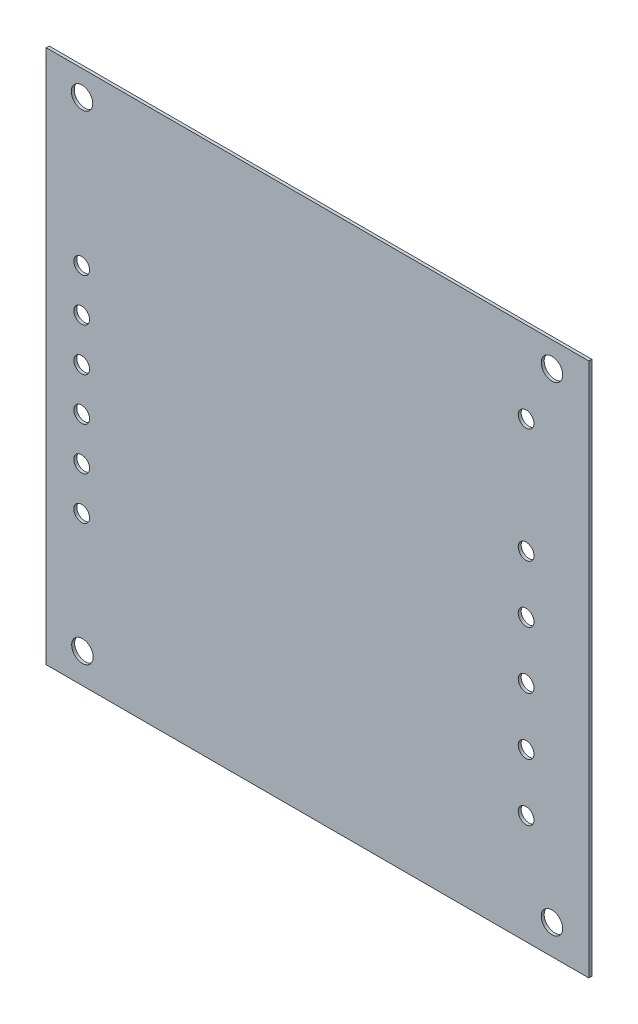
ISO-10303-21;
HEADER;
FILE_DESCRIPTION(('STEP AP214'),'2;1');
FILE_NAME('part.step','',(''),(''),'','','');
FILE_SCHEMA(('AUTOMOTIVE_DESIGN { 1 0 10303 214 1 1 1 1 }'));
ENDSEC;
DATA;
#1=APPLICATION_CONTEXT('core data for automotive mechanical design processes');
#2=APPLICATION_PROTOCOL_DEFINITION('international standard','automotive_design',2000,#1);
#3=PRODUCT_CONTEXT('',#1,'mechanical');
#4=PRODUCT('Part','Part','',(#3));
#5=PRODUCT_RELATED_PRODUCT_CATEGORY('part','',(#4));
#6=PRODUCT_DEFINITION_FORMATION('','',#4);
#7=PRODUCT_DEFINITION_CONTEXT('part definition',#1,'design');
#8=PRODUCT_DEFINITION('design','',#6,#7);
#9=PRODUCT_DEFINITION_SHAPE('','',#8);
#10=(LENGTH_UNIT() NAMED_UNIT(*) SI_UNIT(.MILLI.,.METRE.));
#11=(NAMED_UNIT(*) PLANE_ANGLE_UNIT() SI_UNIT($,.RADIAN.));
#12=(NAMED_UNIT(*) SI_UNIT($,.STERADIAN.) SOLID_ANGLE_UNIT());
#13=UNCERTAINTY_MEASURE_WITH_UNIT(LENGTH_MEASURE(1.E-05),#10,'distance_accuracy_value','');
#14=(GEOMETRIC_REPRESENTATION_CONTEXT(3) GLOBAL_UNCERTAINTY_ASSIGNED_CONTEXT((#13)) GLOBAL_UNIT_ASSIGNED_CONTEXT((#10,
#11,#12)) REPRESENTATION_CONTEXT('',''));
#15=CARTESIAN_POINT('',(0.,0.,0.));
#16=DIRECTION('',(0.,0.,1.));
#17=DIRECTION('',(1.,0.,0.));
#18=AXIS2_PLACEMENT_3D('',#15,#16,#17);
#19=CARTESIAN_POINT('',(37.90950012207,37.338001251221,0.));
#20=DIRECTION('',(0.,0.,-1.));
#21=DIRECTION('',(0.,-1.,0.));
#22=AXIS2_PLACEMENT_3D('',#19,#20,#21);
#23=PLANE('',#22);
#24=CARTESIAN_POINT('',(70.670997619629,71.156997680664,0.));
#25=DIRECTION('',(0.,0.,1.));
#26=DIRECTION('',(1.,0.,0.));
#27=AXIS2_PLACEMENT_3D('',#24,#25,#26);
#28=CIRCLE('',#27,1.5);
#29=CARTESIAN_POINT('',(72.170997619629,71.156997680664,0.));
#30=VERTEX_POINT('',#29);
#31=EDGE_CURVE('E26',#30,#30,#28,.T.);
#32=ORIENTED_EDGE('',*,*,#31,.F.);
#33=EDGE_LOOP('',(#32));
#34=FACE_BOUND('',#33,.T.);
#35=CARTESIAN_POINT('',(67.056,63.267,0.));
#36=DIRECTION('',(0.,0.,1.));
#37=DIRECTION('',(1.,0.,0.));
#38=AXIS2_PLACEMENT_3D('',#35,#36,#37);
#39=CIRCLE('',#38,1.1);
#40=CARTESIAN_POINT('',(68.156,63.267,0.));
#41=VERTEX_POINT('',#40);
#42=EDGE_CURVE('E204',#41,#41,#39,.T.);
#43=ORIENTED_EDGE('',*,*,#42,.F.);
#44=EDGE_LOOP('',(#43));
#45=FACE_BOUND('',#44,.T.);
#46=CARTESIAN_POINT('',(67.056,47.267,0.));
#47=DIRECTION('',(0.,0.,1.));
#48=DIRECTION('',(1.,0.,0.));
#49=AXIS2_PLACEMENT_3D('',#46,#47,#48);
#50=CIRCLE('',#49,1.1);
#51=CARTESIAN_POINT('',(68.156,47.267,0.));
#52=VERTEX_POINT('',#51);
#53=EDGE_CURVE('E195',#52,#52,#50,.T.);
#54=ORIENTED_EDGE('',*,*,#53,.F.);
#55=EDGE_LOOP('',(#54));
#56=FACE_BOUND('',#55,.T.);
#57=CARTESIAN_POINT('',(67.056,39.267,0.));
#58=DIRECTION('',(0.,0.,1.));
#59=DIRECTION('',(1.,0.,0.));
#60=AXIS2_PLACEMENT_3D('',#57,#58,#59);
#61=CIRCLE('',#60,1.1);
#62=CARTESIAN_POINT('',(68.156,39.267,0.));
#63=VERTEX_POINT('',#62);
#64=EDGE_CURVE('E291',#63,#63,#61,.T.);
#65=ORIENTED_EDGE('',*,*,#64,.F.);
#66=EDGE_LOOP('',(#65));
#67=FACE_BOUND('',#66,.T.);
#68=CARTESIAN_POINT('',(67.056,15.267,0.));
#69=DIRECTION('',(0.,0.,1.));
#70=DIRECTION('',(1.,0.,0.));
#71=AXIS2_PLACEMENT_3D('',#68,#69,#70);
#72=CIRCLE('',#71,1.1);
#73=CARTESIAN_POINT('',(68.156,15.267,0.));
#74=VERTEX_POINT('',#73);
#75=EDGE_CURVE('E298',#74,#74,#72,.T.);
#76=ORIENTED_EDGE('',*,*,#75,.F.);
#77=EDGE_LOOP('',(#76));
#78=FACE_BOUND('',#77,.T.);
#79=CARTESIAN_POINT('',(70.670997619629,4.15700006485,0.));
#80=DIRECTION('',(0.,0.,1.));
#81=DIRECTION('',(1.,0.,0.));
#82=AXIS2_PLACEMENT_3D('',#79,#80,#81);
#83=CIRCLE('',#82,1.5);
#84=CARTESIAN_POINT('',(72.170997619629,4.15700006485,0.));
#85=VERTEX_POINT('',#84);
#86=EDGE_CURVE('E323',#85,#85,#83,.T.);
#87=ORIENTED_EDGE('',*,*,#86,.F.);
#88=EDGE_LOOP('',(#87));
#89=FACE_BOUND('',#88,.T.);
#90=CARTESIAN_POINT('',(67.056,31.267,0.));
#91=DIRECTION('',(0.,0.,1.));
#92=DIRECTION('',(1.,0.,0.));
#93=AXIS2_PLACEMENT_3D('',#90,#91,#92);
#94=CIRCLE('',#93,1.1);
#95=CARTESIAN_POINT('',(68.156,31.267,0.));
#96=VERTEX_POINT('',#95);
#97=EDGE_CURVE('E315',#96,#96,#94,.T.);
#98=ORIENTED_EDGE('',*,*,#97,.F.);
#99=EDGE_LOOP('',(#98));
#100=FACE_BOUND('',#99,.T.);
#101=CARTESIAN_POINT('',(67.056,23.267,0.));
#102=DIRECTION('',(0.,0.,1.));
#103=DIRECTION('',(1.,0.,0.));
#104=AXIS2_PLACEMENT_3D('',#101,#102,#103);
#105=CIRCLE('',#104,1.1);
#106=CARTESIAN_POINT('',(68.156,23.267,0.));
#107=VERTEX_POINT('',#106);
#108=EDGE_CURVE('E229',#107,#107,#105,.T.);
#109=ORIENTED_EDGE('',*,*,#108,.F.);
#110=EDGE_LOOP('',(#109));
#111=FACE_BOUND('',#110,.T.);
#112=CARTESIAN_POINT('',(5.,71.156997680664,0.));
#113=DIRECTION('',(0.,0.,1.));
#114=DIRECTION('',(1.,0.,0.));
#115=AXIS2_PLACEMENT_3D('',#112,#113,#114);
#116=CIRCLE('',#115,1.5);
#117=CARTESIAN_POINT('',(6.5,71.156997680664,0.));
#118=VERTEX_POINT('',#117);
#119=EDGE_CURVE('E270',#118,#118,#116,.T.);
#120=ORIENTED_EDGE('',*,*,#119,.F.);
#121=EDGE_LOOP('',(#120));
#122=FACE_BOUND('',#121,.T.);
#123=CARTESIAN_POINT('',(4.953,50.791,0.));
#124=DIRECTION('',(0.,0.,1.));
#125=DIRECTION('',(1.,0.,0.));
#126=AXIS2_PLACEMENT_3D('',#123,#124,#125);
#127=CIRCLE('',#126,1.1);
#128=CARTESIAN_POINT('',(6.053,50.791,0.));
#129=VERTEX_POINT('',#128);
#130=EDGE_CURVE('E251',#129,#129,#127,.T.);
#131=ORIENTED_EDGE('',*,*,#130,.F.);
#132=EDGE_LOOP('',(#131));
#133=FACE_BOUND('',#132,.T.);
#134=CARTESIAN_POINT('',(4.953,44.791,0.));
#135=DIRECTION('',(0.,0.,1.));
#136=DIRECTION('',(1.,0.,0.));
#137=AXIS2_PLACEMENT_3D('',#134,#135,#136);
#138=CIRCLE('',#137,1.1);
#139=CARTESIAN_POINT('',(6.053,44.791,0.));
#140=VERTEX_POINT('',#139);
#141=EDGE_CURVE('E242',#140,#140,#138,.T.);
#142=ORIENTED_EDGE('',*,*,#141,.F.);
#143=EDGE_LOOP('',(#142));
#144=FACE_BOUND('',#143,.T.);
#145=CARTESIAN_POINT('',(4.953,38.791,0.));
#146=DIRECTION('',(0.,0.,1.));
#147=DIRECTION('',(1.,0.,0.));
#148=AXIS2_PLACEMENT_3D('',#145,#146,#147);
#149=CIRCLE('',#148,1.1);
#150=CARTESIAN_POINT('',(6.053,38.791,0.));
#151=VERTEX_POINT('',#150);
#152=EDGE_CURVE('E264',#151,#151,#149,.T.);
#153=ORIENTED_EDGE('',*,*,#152,.F.);
#154=EDGE_LOOP('',(#153));
#155=FACE_BOUND('',#154,.T.);
#156=CARTESIAN_POINT('',(4.953,20.791,0.));
#157=DIRECTION('',(0.,0.,1.));
#158=DIRECTION('',(1.,0.,0.));
#159=AXIS2_PLACEMENT_3D('',#156,#157,#158);
#160=CIRCLE('',#159,1.1);
#161=CARTESIAN_POINT('',(6.053,20.791,0.));
#162=VERTEX_POINT('',#161);
#163=EDGE_CURVE('E165',#162,#162,#160,.T.);
#164=ORIENTED_EDGE('',*,*,#163,.F.);
#165=EDGE_LOOP('',(#164));
#166=FACE_BOUND('',#165,.T.);
#167=CARTESIAN_POINT('',(5.056000232697,4.190999984741,0.));
#168=DIRECTION('',(0.,0.,1.));
#169=DIRECTION('',(1.,0.,0.));
#170=AXIS2_PLACEMENT_3D('',#167,#168,#169);
#171=CIRCLE('',#170,1.5);
#172=CARTESIAN_POINT('',(6.556000232697,4.190999984741,0.));
#173=VERTEX_POINT('',#172);
#174=EDGE_CURVE('E157',#173,#173,#171,.T.);
#175=ORIENTED_EDGE('',*,*,#174,.F.);
#176=EDGE_LOOP('',(#175));
#177=FACE_BOUND('',#176,.T.);
#178=CARTESIAN_POINT('',(4.953,32.791,0.));
#179=DIRECTION('',(0.,0.,1.));
#180=DIRECTION('',(1.,0.,0.));
#181=AXIS2_PLACEMENT_3D('',#178,#179,#180);
#182=CIRCLE('',#181,1.1);
#183=CARTESIAN_POINT('',(6.053,32.791,0.));
#184=VERTEX_POINT('',#183);
#185=EDGE_CURVE('E182',#184,#184,#182,.T.);
#186=ORIENTED_EDGE('',*,*,#185,.F.);
#187=EDGE_LOOP('',(#186));
#188=FACE_BOUND('',#187,.T.);
#189=CARTESIAN_POINT('',(4.953,26.791,0.));
#190=DIRECTION('',(0.,0.,1.));
#191=DIRECTION('',(1.,0.,0.));
#192=AXIS2_PLACEMENT_3D('',#189,#190,#191);
#193=CIRCLE('',#192,1.1);
#194=CARTESIAN_POINT('',(6.053,26.791,0.));
#195=VERTEX_POINT('',#194);
#196=EDGE_CURVE('E255',#195,#195,#193,.T.);
#197=ORIENTED_EDGE('',*,*,#196,.F.);
#198=EDGE_LOOP('',(#197));
#199=FACE_BOUND('',#198,.T.);
#200=DIRECTION('',(-1.,0.,0.));
#201=VECTOR('',#200,1.);
#202=CARTESIAN_POINT('',(75.819000244141,0.,0.));
#203=LINE('',#202,#201);
#204=CARTESIAN_POINT('',(75.819000244141,0.,0.));
#205=VERTEX_POINT('',#204);
#206=CARTESIAN_POINT('',(0.,0.,0.));
#207=VERTEX_POINT('',#206);
#208=EDGE_CURVE('E173',#205,#207,#203,.T.);
#209=ORIENTED_EDGE('',*,*,#208,.F.);
#210=DIRECTION('',(0.,-1.,0.));
#211=VECTOR('',#210,1.);
#212=CARTESIAN_POINT('',(75.819000244141,74.676002502441,0.));
#213=LINE('',#212,#211);
#214=CARTESIAN_POINT('',(75.819000244141,74.676002502441,0.));
#215=VERTEX_POINT('',#214);
#216=EDGE_CURVE('E280',#215,#205,#213,.T.);
#217=ORIENTED_EDGE('',*,*,#216,.F.);
#218=DIRECTION('',(1.,0.,0.));
#219=VECTOR('',#218,1.);
#220=CARTESIAN_POINT('',(0.,74.676002502441,0.));
#221=LINE('',#220,#219);
#222=CARTESIAN_POINT('',(0.,74.676002502441,0.));
#223=VERTEX_POINT('',#222);
#224=EDGE_CURVE('E221',#223,#215,#221,.T.);
#225=ORIENTED_EDGE('',*,*,#224,.F.);
#226=DIRECTION('',(0.,1.,0.));
#227=VECTOR('',#226,1.);
#228=CARTESIAN_POINT('',(0.,0.,0.));
#229=LINE('',#228,#227);
#230=EDGE_CURVE('E210',#207,#223,#229,.T.);
#231=ORIENTED_EDGE('',*,*,#230,.F.);
#232=EDGE_LOOP('',(#209,#217,#225,#231));
#233=FACE_BOUND('',#232,.T.);
#234=ADVANCED_FACE('F15',(#34,#45,#56,#67,#78,#89,#100,#111,#122,#133,#144,#155,#166,#177,#188,
#199,#233),#23,.F.);
#235=CARTESIAN_POINT('',(37.90950012207,37.338001251221,-0.41148));
#236=DIRECTION('',(0.,0.,-1.));
#237=DIRECTION('',(0.,-1.,0.));
#238=AXIS2_PLACEMENT_3D('',#235,#236,#237);
#239=PLANE('',#238);
#240=CARTESIAN_POINT('',(70.670997619629,71.156997680664,-0.41148));
#241=DIRECTION('',(0.,0.,1.));
#242=DIRECTION('',(1.,0.,0.));
#243=AXIS2_PLACEMENT_3D('',#240,#241,#242);
#244=CIRCLE('',#243,1.5);
#245=CARTESIAN_POINT('',(72.170997619629,71.156997680664,-0.41148));
#246=VERTEX_POINT('',#245);
#247=EDGE_CURVE('E10',#246,#246,#244,.T.);
#248=ORIENTED_EDGE('',*,*,#247,.T.);
#249=EDGE_LOOP('',(#248));
#250=FACE_BOUND('',#249,.T.);
#251=CARTESIAN_POINT('',(67.056,63.267,-0.41148));
#252=DIRECTION('',(0.,0.,1.));
#253=DIRECTION('',(1.,0.,0.));
#254=AXIS2_PLACEMENT_3D('',#251,#252,#253);
#255=CIRCLE('',#254,1.1);
#256=CARTESIAN_POINT('',(68.156,63.267,-0.41148));
#257=VERTEX_POINT('',#256);
#258=EDGE_CURVE('E200',#257,#257,#255,.T.);
#259=ORIENTED_EDGE('',*,*,#258,.T.);
#260=EDGE_LOOP('',(#259));
#261=FACE_BOUND('',#260,.T.);
#262=CARTESIAN_POINT('',(67.056,47.267,-0.41148));
#263=DIRECTION('',(0.,0.,1.));
#264=DIRECTION('',(1.,0.,0.));
#265=AXIS2_PLACEMENT_3D('',#262,#263,#264);
#266=CIRCLE('',#265,1.1);
#267=CARTESIAN_POINT('',(68.156,47.267,-0.41148));
#268=VERTEX_POINT('',#267);
#269=EDGE_CURVE('E199',#268,#268,#266,.T.);
#270=ORIENTED_EDGE('',*,*,#269,.T.);
#271=EDGE_LOOP('',(#270));
#272=FACE_BOUND('',#271,.T.);
#273=CARTESIAN_POINT('',(67.056,39.267,-0.41148));
#274=DIRECTION('',(0.,0.,1.));
#275=DIRECTION('',(1.,0.,0.));
#276=AXIS2_PLACEMENT_3D('',#273,#274,#275);
#277=CIRCLE('',#276,1.1);
#278=CARTESIAN_POINT('',(68.156,39.267,-0.41148));
#279=VERTEX_POINT('',#278);
#280=EDGE_CURVE('E196',#279,#279,#277,.T.);
#281=ORIENTED_EDGE('',*,*,#280,.T.);
#282=EDGE_LOOP('',(#281));
#283=FACE_BOUND('',#282,.T.);
#284=CARTESIAN_POINT('',(67.056,15.267,-0.41148));
#285=DIRECTION('',(0.,0.,1.));
#286=DIRECTION('',(1.,0.,0.));
#287=AXIS2_PLACEMENT_3D('',#284,#285,#286);
#288=CIRCLE('',#287,1.1);
#289=CARTESIAN_POINT('',(68.156,15.267,-0.41148));
#290=VERTEX_POINT('',#289);
#291=EDGE_CURVE('E171',#290,#290,#288,.T.);
#292=ORIENTED_EDGE('',*,*,#291,.T.);
#293=EDGE_LOOP('',(#292));
#294=FACE_BOUND('',#293,.T.);
#295=CARTESIAN_POINT('',(70.670997619629,4.15700006485,-0.41148));
#296=DIRECTION('',(0.,0.,1.));
#297=DIRECTION('',(1.,0.,0.));
#298=AXIS2_PLACEMENT_3D('',#295,#296,#297);
#299=CIRCLE('',#298,1.5);
#300=CARTESIAN_POINT('',(72.170997619629,4.15700006485,-0.41148));
#301=VERTEX_POINT('',#300);
#302=EDGE_CURVE('E305',#301,#301,#299,.T.);
#303=ORIENTED_EDGE('',*,*,#302,.T.);
#304=EDGE_LOOP('',(#303));
#305=FACE_BOUND('',#304,.T.);
#306=CARTESIAN_POINT('',(67.056,31.267,-0.41148));
#307=DIRECTION('',(0.,0.,1.));
#308=DIRECTION('',(1.,0.,0.));
#309=AXIS2_PLACEMENT_3D('',#306,#307,#308);
#310=CIRCLE('',#309,1.1);
#311=CARTESIAN_POINT('',(68.156,31.267,-0.41148));
#312=VERTEX_POINT('',#311);
#313=EDGE_CURVE('E319',#312,#312,#310,.T.);
#314=ORIENTED_EDGE('',*,*,#313,.T.);
#315=EDGE_LOOP('',(#314));
#316=FACE_BOUND('',#315,.T.);
#317=CARTESIAN_POINT('',(67.056,23.267,-0.41148));
#318=DIRECTION('',(0.,0.,1.));
#319=DIRECTION('',(1.,0.,0.));
#320=AXIS2_PLACEMENT_3D('',#317,#318,#319);
#321=CIRCLE('',#320,1.1);
#322=CARTESIAN_POINT('',(68.156,23.267,-0.41148));
#323=VERTEX_POINT('',#322);
#324=EDGE_CURVE('E696',#323,#323,#321,.T.);
#325=ORIENTED_EDGE('',*,*,#324,.T.);
#326=EDGE_LOOP('',(#325));
#327=FACE_BOUND('',#326,.T.);
#328=CARTESIAN_POINT('',(5.,71.156997680664,-0.41148));
#329=DIRECTION('',(0.,0.,1.));
#330=DIRECTION('',(1.,0.,0.));
#331=AXIS2_PLACEMENT_3D('',#328,#329,#330);
#332=CIRCLE('',#331,1.5);
#333=CARTESIAN_POINT('',(6.5,71.156997680664,-0.41148));
#334=VERTEX_POINT('',#333);
#335=EDGE_CURVE('E230',#334,#334,#332,.T.);
#336=ORIENTED_EDGE('',*,*,#335,.T.);
#337=EDGE_LOOP('',(#336));
#338=FACE_BOUND('',#337,.T.);
#339=CARTESIAN_POINT('',(4.953,50.791,-0.41148));
#340=DIRECTION('',(0.,0.,1.));
#341=DIRECTION('',(1.,0.,0.));
#342=AXIS2_PLACEMENT_3D('',#339,#340,#341);
#343=CIRCLE('',#342,1.1);
#344=CARTESIAN_POINT('',(6.053,50.791,-0.41148));
#345=VERTEX_POINT('',#344);
#346=EDGE_CURVE('E247',#345,#345,#343,.T.);
#347=ORIENTED_EDGE('',*,*,#346,.T.);
#348=EDGE_LOOP('',(#347));
#349=FACE_BOUND('',#348,.T.);
#350=CARTESIAN_POINT('',(4.953,44.791,-0.41148));
#351=DIRECTION('',(0.,0.,1.));
#352=DIRECTION('',(1.,0.,0.));
#353=AXIS2_PLACEMENT_3D('',#350,#351,#352);
#354=CIRCLE('',#353,1.1);
#355=CARTESIAN_POINT('',(6.053,44.791,-0.41148));
#356=VERTEX_POINT('',#355);
#357=EDGE_CURVE('E237',#356,#356,#354,.T.);
#358=ORIENTED_EDGE('',*,*,#357,.T.);
#359=EDGE_LOOP('',(#358));
#360=FACE_BOUND('',#359,.T.);
#361=CARTESIAN_POINT('',(4.953,38.791,-0.41148));
#362=DIRECTION('',(0.,0.,1.));
#363=DIRECTION('',(1.,0.,0.));
#364=AXIS2_PLACEMENT_3D('',#361,#362,#363);
#365=CIRCLE('',#364,1.1);
#366=CARTESIAN_POINT('',(6.053,38.791,-0.41148));
#367=VERTEX_POINT('',#366);
#368=EDGE_CURVE('E279',#367,#367,#365,.T.);
#369=ORIENTED_EDGE('',*,*,#368,.T.);
#370=EDGE_LOOP('',(#369));
#371=FACE_BOUND('',#370,.T.);
#372=CARTESIAN_POINT('',(4.953,20.791,-0.41148));
#373=DIRECTION('',(0.,0.,1.));
#374=DIRECTION('',(1.,0.,0.));
#375=AXIS2_PLACEMENT_3D('',#372,#373,#374);
#376=CIRCLE('',#375,1.1);
#377=CARTESIAN_POINT('',(6.053,20.791,-0.41148));
#378=VERTEX_POINT('',#377);
#379=EDGE_CURVE('E187',#378,#378,#376,.T.);
#380=ORIENTED_EDGE('',*,*,#379,.T.);
#381=EDGE_LOOP('',(#380));
#382=FACE_BOUND('',#381,.T.);
#383=CARTESIAN_POINT('',(5.056000232697,4.190999984741,-0.41148));
#384=DIRECTION('',(0.,0.,1.));
#385=DIRECTION('',(1.,0.,0.));
#386=AXIS2_PLACEMENT_3D('',#383,#384,#385);
#387=CIRCLE('',#386,1.5);
#388=CARTESIAN_POINT('',(6.556000232697,4.190999984741,-0.41148));
#389=VERTEX_POINT('',#388);
#390=EDGE_CURVE('E149',#389,#389,#387,.T.);
#391=ORIENTED_EDGE('',*,*,#390,.T.);
#392=EDGE_LOOP('',(#391));
#393=FACE_BOUND('',#392,.T.);
#394=CARTESIAN_POINT('',(4.953,32.791,-0.41148));
#395=DIRECTION('',(0.,0.,1.));
#396=DIRECTION('',(1.,0.,0.));
#397=AXIS2_PLACEMENT_3D('',#394,#395,#396);
#398=CIRCLE('',#397,1.1);
#399=CARTESIAN_POINT('',(6.053,32.791,-0.41148));
#400=VERTEX_POINT('',#399);
#401=EDGE_CURVE('E184',#400,#400,#398,.T.);
#402=ORIENTED_EDGE('',*,*,#401,.T.);
#403=EDGE_LOOP('',(#402));
#404=FACE_BOUND('',#403,.T.);
#405=CARTESIAN_POINT('',(4.953,26.791,-0.41148));
#406=DIRECTION('',(0.,0.,1.));
#407=DIRECTION('',(1.,0.,0.));
#408=AXIS2_PLACEMENT_3D('',#405,#406,#407);
#409=CIRCLE('',#408,1.1);
#410=CARTESIAN_POINT('',(6.053,26.791,-0.41148));
#411=VERTEX_POINT('',#410);
#412=EDGE_CURVE('E297',#411,#411,#409,.T.);
#413=ORIENTED_EDGE('',*,*,#412,.T.);
#414=EDGE_LOOP('',(#413));
#415=FACE_BOUND('',#414,.T.);
#416=DIRECTION('',(0.,1.,0.));
#417=VECTOR('',#416,1.);
#418=CARTESIAN_POINT('',(0.,0.,-0.41148));
#419=LINE('',#418,#417);
#420=CARTESIAN_POINT('',(0.,0.,-0.41148));
#421=VERTEX_POINT('',#420);
#422=CARTESIAN_POINT('',(0.,74.676002502441,-0.41148));
#423=VERTEX_POINT('',#422);
#424=EDGE_CURVE('E209',#421,#423,#419,.T.);
#425=ORIENTED_EDGE('',*,*,#424,.T.);
#426=DIRECTION('',(1.,0.,0.));
#427=VECTOR('',#426,1.);
#428=CARTESIAN_POINT('',(0.,74.676002502441,-0.41148));
#429=LINE('',#428,#427);
#430=CARTESIAN_POINT('',(75.819000244141,74.676002502441,-0.41148));
#431=VERTEX_POINT('',#430);
#432=EDGE_CURVE('E220',#423,#431,#429,.T.);
#433=ORIENTED_EDGE('',*,*,#432,.T.);
#434=DIRECTION('',(0.,-1.,0.));
#435=VECTOR('',#434,1.);
#436=CARTESIAN_POINT('',(75.819000244141,74.676002502441,-0.41148));
#437=LINE('',#436,#435);
#438=CARTESIAN_POINT('',(75.819000244141,0.,-0.41148));
#439=VERTEX_POINT('',#438);
#440=EDGE_CURVE('E177',#431,#439,#437,.T.);
#441=ORIENTED_EDGE('',*,*,#440,.T.);
#442=DIRECTION('',(-1.,0.,0.));
#443=VECTOR('',#442,1.);
#444=CARTESIAN_POINT('',(75.819000244141,0.,-0.41148));
#445=LINE('',#444,#443);
#446=EDGE_CURVE('E176',#439,#421,#445,.T.);
#447=ORIENTED_EDGE('',*,*,#446,.T.);
#448=EDGE_LOOP('',(#425,#433,#441,#447));
#449=FACE_BOUND('',#448,.T.);
#450=ADVANCED_FACE('F150',(#250,#261,#272,#283,#294,#305,#316,#327,#338,#349,#360,#371,#382,
#393,#404,#415,#449),#239,.T.);
#451=CARTESIAN_POINT('',(70.670997619629,71.156997680664,-0.41148));
#452=DIRECTION('',(0.,0.,-1.));
#453=DIRECTION('',(1.,0.,0.));
#454=AXIS2_PLACEMENT_3D('',#451,#452,#453);
#455=CYLINDRICAL_SURFACE('',#454,1.5);
#456=DIRECTION('',(0.,0.,1.));
#457=VECTOR('',#456,1.);
#458=CARTESIAN_POINT('',(72.170997619629,71.156997680664,-0.41148));
#459=LINE('',#458,#457);
#460=EDGE_CURVE('E203',#246,#30,#459,.T.);
#461=ORIENTED_EDGE('',*,*,#460,.T.);
#462=ORIENTED_EDGE('',*,*,#31,.T.);
#463=ORIENTED_EDGE('',*,*,#460,.F.);
#464=ORIENTED_EDGE('',*,*,#247,.F.);
#465=EDGE_LOOP('',(#461,#462,#463,#464));
#466=FACE_BOUND('',#465,.T.);
#467=ADVANCED_FACE('F427',(#466),#455,.F.);
#468=CARTESIAN_POINT('',(67.056,63.267,-0.41148));
#469=DIRECTION('',(0.,0.,-1.));
#470=DIRECTION('',(1.,0.,0.));
#471=AXIS2_PLACEMENT_3D('',#468,#469,#470);
#472=CYLINDRICAL_SURFACE('',#471,1.1);
#473=DIRECTION('',(0.,0.,1.));
#474=VECTOR('',#473,1.);
#475=CARTESIAN_POINT('',(68.156,63.267,-0.41148));
#476=LINE('',#475,#474);
#477=EDGE_CURVE('E233',#257,#41,#476,.T.);
#478=ORIENTED_EDGE('',*,*,#477,.T.);
#479=ORIENTED_EDGE('',*,*,#42,.T.);
#480=ORIENTED_EDGE('',*,*,#477,.F.);
#481=ORIENTED_EDGE('',*,*,#258,.F.);
#482=EDGE_LOOP('',(#478,#479,#480,#481));
#483=FACE_BOUND('',#482,.T.);
#484=ADVANCED_FACE('F416',(#483),#472,.F.);
#485=CARTESIAN_POINT('',(67.056,47.267,-0.41148));
#486=DIRECTION('',(0.,0.,-1.));
#487=DIRECTION('',(1.,0.,0.));
#488=AXIS2_PLACEMENT_3D('',#485,#486,#487);
#489=CYLINDRICAL_SURFACE('',#488,1.1);
#490=DIRECTION('',(0.,0.,1.));
#491=VECTOR('',#490,1.);
#492=CARTESIAN_POINT('',(68.156,47.267,-0.41148));
#493=LINE('',#492,#491);
#494=EDGE_CURVE('E191',#268,#52,#493,.T.);
#495=ORIENTED_EDGE('',*,*,#494,.T.);
#496=ORIENTED_EDGE('',*,*,#53,.T.);
#497=ORIENTED_EDGE('',*,*,#494,.F.);
#498=ORIENTED_EDGE('',*,*,#269,.F.);
#499=EDGE_LOOP('',(#495,#496,#497,#498));
#500=FACE_BOUND('',#499,.T.);
#501=ADVANCED_FACE('F424',(#500),#489,.F.);
#502=CARTESIAN_POINT('',(67.056,39.267,-0.41148));
#503=DIRECTION('',(0.,0.,-1.));
#504=DIRECTION('',(1.,0.,0.));
#505=AXIS2_PLACEMENT_3D('',#502,#503,#504);
#506=CYLINDRICAL_SURFACE('',#505,1.1);
#507=DIRECTION('',(0.,0.,1.));
#508=VECTOR('',#507,1.);
#509=CARTESIAN_POINT('',(68.156,39.267,-0.41148));
#510=LINE('',#509,#508);
#511=EDGE_CURVE('E287',#279,#63,#510,.T.);
#512=ORIENTED_EDGE('',*,*,#511,.T.);
#513=ORIENTED_EDGE('',*,*,#64,.T.);
#514=ORIENTED_EDGE('',*,*,#511,.F.);
#515=ORIENTED_EDGE('',*,*,#280,.F.);
#516=EDGE_LOOP('',(#512,#513,#514,#515));
#517=FACE_BOUND('',#516,.T.);
#518=ADVANCED_FACE('F340',(#517),#506,.F.);
#519=CARTESIAN_POINT('',(67.056,15.267,-0.41148));
#520=DIRECTION('',(0.,0.,-1.));
#521=DIRECTION('',(1.,0.,0.));
#522=AXIS2_PLACEMENT_3D('',#519,#520,#521);
#523=CYLINDRICAL_SURFACE('',#522,1.1);
#524=DIRECTION('',(0.,0.,1.));
#525=VECTOR('',#524,1.);
#526=CARTESIAN_POINT('',(68.156,15.267,-0.41148));
#527=LINE('',#526,#525);
#528=EDGE_CURVE('E301',#290,#74,#527,.T.);
#529=ORIENTED_EDGE('',*,*,#528,.T.);
#530=ORIENTED_EDGE('',*,*,#75,.T.);
#531=ORIENTED_EDGE('',*,*,#528,.F.);
#532=ORIENTED_EDGE('',*,*,#291,.F.);
#533=EDGE_LOOP('',(#529,#530,#531,#532));
#534=FACE_BOUND('',#533,.T.);
#535=ADVANCED_FACE('F475',(#534),#523,.F.);
#536=CARTESIAN_POINT('',(70.670997619629,4.15700006485,-0.41148));
#537=DIRECTION('',(0.,0.,-1.));
#538=DIRECTION('',(1.,0.,0.));
#539=AXIS2_PLACEMENT_3D('',#536,#537,#538);
#540=CYLINDRICAL_SURFACE('',#539,1.5);
#541=DIRECTION('',(0.,0.,1.));
#542=VECTOR('',#541,1.);
#543=CARTESIAN_POINT('',(72.170997619629,4.15700006485,-0.41148));
#544=LINE('',#543,#542);
#545=EDGE_CURVE('E708',#301,#85,#544,.T.);
#546=ORIENTED_EDGE('',*,*,#545,.T.);
#547=ORIENTED_EDGE('',*,*,#86,.T.);
#548=ORIENTED_EDGE('',*,*,#545,.F.);
#549=ORIENTED_EDGE('',*,*,#302,.F.);
#550=EDGE_LOOP('',(#546,#547,#548,#549));
#551=FACE_BOUND('',#550,.T.);
#552=ADVANCED_FACE('F471',(#551),#540,.F.);
#553=CARTESIAN_POINT('',(67.056,31.267,-0.41148));
#554=DIRECTION('',(0.,0.,-1.));
#555=DIRECTION('',(1.,0.,0.));
#556=AXIS2_PLACEMENT_3D('',#553,#554,#555);
#557=CYLINDRICAL_SURFACE('',#556,1.1);
#558=DIRECTION('',(0.,0.,1.));
#559=VECTOR('',#558,1.);
#560=CARTESIAN_POINT('',(68.156,31.267,-0.41148));
#561=LINE('',#560,#559);
#562=EDGE_CURVE('E320',#312,#96,#561,.T.);
#563=ORIENTED_EDGE('',*,*,#562,.T.);
#564=ORIENTED_EDGE('',*,*,#97,.T.);
#565=ORIENTED_EDGE('',*,*,#562,.F.);
#566=ORIENTED_EDGE('',*,*,#313,.F.);
#567=EDGE_LOOP('',(#563,#564,#565,#566));
#568=FACE_BOUND('',#567,.T.);
#569=ADVANCED_FACE('F474',(#568),#557,.F.);
#570=CARTESIAN_POINT('',(67.056,23.267,-0.41148));
#571=DIRECTION('',(0.,0.,-1.));
#572=DIRECTION('',(1.,0.,0.));
#573=AXIS2_PLACEMENT_3D('',#570,#571,#572);
#574=CYLINDRICAL_SURFACE('',#573,1.1);
#575=DIRECTION('',(0.,0.,1.));
#576=VECTOR('',#575,1.);
#577=CARTESIAN_POINT('',(68.156,23.267,-0.41148));
#578=LINE('',#577,#576);
#579=EDGE_CURVE('E225',#323,#107,#578,.T.);
#580=ORIENTED_EDGE('',*,*,#579,.T.);
#581=ORIENTED_EDGE('',*,*,#108,.T.);
#582=ORIENTED_EDGE('',*,*,#579,.F.);
#583=ORIENTED_EDGE('',*,*,#324,.F.);
#584=EDGE_LOOP('',(#580,#581,#582,#583));
#585=FACE_BOUND('',#584,.T.);
#586=ADVANCED_FACE('F441',(#585),#574,.F.);
#587=CARTESIAN_POINT('',(5.,71.156997680664,-0.41148));
#588=DIRECTION('',(0.,0.,-1.));
#589=DIRECTION('',(1.,0.,0.));
#590=AXIS2_PLACEMENT_3D('',#587,#588,#589);
#591=CYLINDRICAL_SURFACE('',#590,1.5);
#592=DIRECTION('',(0.,0.,1.));
#593=VECTOR('',#592,1.);
#594=CARTESIAN_POINT('',(6.5,71.156997680664,-0.41148));
#595=LINE('',#594,#593);
#596=EDGE_CURVE('E250',#334,#118,#595,.T.);
#597=ORIENTED_EDGE('',*,*,#596,.T.);
#598=ORIENTED_EDGE('',*,*,#119,.T.);
#599=ORIENTED_EDGE('',*,*,#596,.F.);
#600=ORIENTED_EDGE('',*,*,#335,.F.);
#601=EDGE_LOOP('',(#597,#598,#599,#600));
#602=FACE_BOUND('',#601,.T.);
#603=ADVANCED_FACE('F437',(#602),#591,.F.);
#604=CARTESIAN_POINT('',(4.953,50.791,-0.41148));
#605=DIRECTION('',(0.,0.,-1.));
#606=DIRECTION('',(1.,0.,0.));
#607=AXIS2_PLACEMENT_3D('',#604,#605,#606);
#608=CYLINDRICAL_SURFACE('',#607,1.1);
#609=DIRECTION('',(0.,0.,1.));
#610=VECTOR('',#609,1.);
#611=CARTESIAN_POINT('',(6.053,50.791,-0.41148));
#612=LINE('',#611,#610);
#613=EDGE_CURVE('E241',#345,#129,#612,.T.);
#614=ORIENTED_EDGE('',*,*,#613,.T.);
#615=ORIENTED_EDGE('',*,*,#130,.T.);
#616=ORIENTED_EDGE('',*,*,#613,.F.);
#617=ORIENTED_EDGE('',*,*,#346,.F.);
#618=EDGE_LOOP('',(#614,#615,#616,#617));
#619=FACE_BOUND('',#618,.T.);
#620=ADVANCED_FACE('F440',(#619),#608,.F.);
#621=CARTESIAN_POINT('',(4.953,44.791,-0.41148));
#622=DIRECTION('',(0.,0.,-1.));
#623=DIRECTION('',(1.,0.,0.));
#624=AXIS2_PLACEMENT_3D('',#621,#622,#623);
#625=CYLINDRICAL_SURFACE('',#624,1.1);
#626=DIRECTION('',(0.,0.,1.));
#627=VECTOR('',#626,1.);
#628=CARTESIAN_POINT('',(6.053,44.791,-0.41148));
#629=LINE('',#628,#627);
#630=EDGE_CURVE('E275',#356,#140,#629,.T.);
#631=ORIENTED_EDGE('',*,*,#630,.T.);
#632=ORIENTED_EDGE('',*,*,#141,.T.);
#633=ORIENTED_EDGE('',*,*,#630,.F.);
#634=ORIENTED_EDGE('',*,*,#357,.F.);
#635=EDGE_LOOP('',(#631,#632,#633,#634));
#636=FACE_BOUND('',#635,.T.);
#637=ADVANCED_FACE('F457',(#636),#625,.F.);
#638=CARTESIAN_POINT('',(4.953,38.791,-0.41148));
#639=DIRECTION('',(0.,0.,-1.));
#640=DIRECTION('',(1.,0.,0.));
#641=AXIS2_PLACEMENT_3D('',#638,#639,#640);
#642=CYLINDRICAL_SURFACE('',#641,1.1);
#643=DIRECTION('',(0.,0.,1.));
#644=VECTOR('',#643,1.);
#645=CARTESIAN_POINT('',(6.053,38.791,-0.41148));
#646=LINE('',#645,#644);
#647=EDGE_CURVE('E190',#367,#151,#646,.T.);
#648=ORIENTED_EDGE('',*,*,#647,.T.);
#649=ORIENTED_EDGE('',*,*,#152,.T.);
#650=ORIENTED_EDGE('',*,*,#647,.F.);
#651=ORIENTED_EDGE('',*,*,#368,.F.);
#652=EDGE_LOOP('',(#648,#649,#650,#651));
#653=FACE_BOUND('',#652,.T.);
#654=ADVANCED_FACE('F460',(#653),#642,.F.);
#655=CARTESIAN_POINT('',(4.953,20.791,-0.41148));
#656=DIRECTION('',(0.,0.,-1.));
#657=DIRECTION('',(1.,0.,0.));
#658=AXIS2_PLACEMENT_3D('',#655,#656,#657);
#659=CYLINDRICAL_SURFACE('',#658,1.1);
#660=DIRECTION('',(0.,0.,1.));
#661=VECTOR('',#660,1.);
#662=CARTESIAN_POINT('',(6.053,20.791,-0.41148));
#663=LINE('',#662,#661);
#664=EDGE_CURVE('E156',#378,#162,#663,.T.);
#665=ORIENTED_EDGE('',*,*,#664,.T.);
#666=ORIENTED_EDGE('',*,*,#163,.T.);
#667=ORIENTED_EDGE('',*,*,#664,.F.);
#668=ORIENTED_EDGE('',*,*,#379,.F.);
#669=EDGE_LOOP('',(#665,#666,#667,#668));
#670=FACE_BOUND('',#669,.T.);
#671=ADVANCED_FACE('F462',(#670),#659,.F.);
#672=CARTESIAN_POINT('',(5.056000232697,4.190999984741,-0.41148));
#673=DIRECTION('',(0.,0.,-1.));
#674=DIRECTION('',(1.,0.,0.));
#675=AXIS2_PLACEMENT_3D('',#672,#673,#674);
#676=CYLINDRICAL_SURFACE('',#675,1.5);
#677=DIRECTION('',(0.,0.,1.));
#678=VECTOR('',#677,1.);
#679=CARTESIAN_POINT('',(6.556000232697,4.190999984741,-0.41148));
#680=LINE('',#679,#678);
#681=EDGE_CURVE('E167',#389,#173,#680,.T.);
#682=ORIENTED_EDGE('',*,*,#681,.T.);
#683=ORIENTED_EDGE('',*,*,#174,.T.);
#684=ORIENTED_EDGE('',*,*,#681,.F.);
#685=ORIENTED_EDGE('',*,*,#390,.F.);
#686=EDGE_LOOP('',(#682,#683,#684,#685));
#687=FACE_BOUND('',#686,.T.);
#688=ADVANCED_FACE('F453',(#687),#676,.F.);
#689=CARTESIAN_POINT('',(4.953,32.791,-0.41148));
#690=DIRECTION('',(0.,0.,-1.));
#691=DIRECTION('',(1.,0.,0.));
#692=AXIS2_PLACEMENT_3D('',#689,#690,#691);
#693=CYLINDRICAL_SURFACE('',#692,1.1);
#694=DIRECTION('',(0.,0.,1.));
#695=VECTOR('',#694,1.);
#696=CARTESIAN_POINT('',(6.053,32.791,-0.41148));
#697=LINE('',#696,#695);
#698=EDGE_CURVE('E185',#400,#184,#697,.T.);
#699=ORIENTED_EDGE('',*,*,#698,.T.);
#700=ORIENTED_EDGE('',*,*,#185,.T.);
#701=ORIENTED_EDGE('',*,*,#698,.F.);
#702=ORIENTED_EDGE('',*,*,#401,.F.);
#703=EDGE_LOOP('',(#699,#700,#701,#702));
#704=FACE_BOUND('',#703,.T.);
#705=ADVANCED_FACE('F450',(#704),#693,.F.);
#706=CARTESIAN_POINT('',(4.953,26.791,-0.41148));
#707=DIRECTION('',(0.,0.,-1.));
#708=DIRECTION('',(1.,0.,0.));
#709=AXIS2_PLACEMENT_3D('',#706,#707,#708);
#710=CYLINDRICAL_SURFACE('',#709,1.1);
#711=DIRECTION('',(0.,0.,1.));
#712=VECTOR('',#711,1.);
#713=CARTESIAN_POINT('',(6.053,26.791,-0.41148));
#714=LINE('',#713,#712);
#715=EDGE_CURVE('E181',#411,#195,#714,.T.);
#716=ORIENTED_EDGE('',*,*,#715,.T.);
#717=ORIENTED_EDGE('',*,*,#196,.T.);
#718=ORIENTED_EDGE('',*,*,#715,.F.);
#719=ORIENTED_EDGE('',*,*,#412,.F.);
#720=EDGE_LOOP('',(#716,#717,#718,#719));
#721=FACE_BOUND('',#720,.T.);
#722=ADVANCED_FACE('F445',(#721),#710,.F.);
#723=CARTESIAN_POINT('',(75.819000244141,0.,-0.41148));
#724=DIRECTION('',(0.,-1.,0.));
#725=DIRECTION('',(0.,0.,-1.));
#726=AXIS2_PLACEMENT_3D('',#723,#724,#725);
#727=PLANE('',#726);
#728=DIRECTION('',(0.,0.,1.));
#729=VECTOR('',#728,1.);
#730=CARTESIAN_POINT('',(75.819000244141,0.,-0.41148));
#731=LINE('',#730,#729);
#732=EDGE_CURVE('E246',#439,#205,#731,.T.);
#733=ORIENTED_EDGE('',*,*,#732,.T.);
#734=ORIENTED_EDGE('',*,*,#208,.T.);
#735=DIRECTION('',(0.,0.,1.));
#736=VECTOR('',#735,1.);
#737=CARTESIAN_POINT('',(0.,0.,-0.41148));
#738=LINE('',#737,#736);
#739=EDGE_CURVE('E19',#421,#207,#738,.T.);
#740=ORIENTED_EDGE('',*,*,#739,.F.);
#741=ORIENTED_EDGE('',*,*,#446,.F.);
#742=EDGE_LOOP('',(#733,#734,#740,#741));
#743=FACE_BOUND('',#742,.T.);
#744=ADVANCED_FACE('F385',(#743),#727,.T.);
#745=CARTESIAN_POINT('',(75.819000244141,74.676002502441,-0.41148));
#746=DIRECTION('',(1.,0.,0.));
#747=DIRECTION('',(0.,1.,0.));
#748=AXIS2_PLACEMENT_3D('',#745,#746,#747);
#749=PLANE('',#748);
#750=DIRECTION('',(0.,0.,1.));
#751=VECTOR('',#750,1.);
#752=CARTESIAN_POINT('',(75.819000244141,74.676002502441,-0.41148));
#753=LINE('',#752,#751);
#754=EDGE_CURVE('E216',#431,#215,#753,.T.);
#755=ORIENTED_EDGE('',*,*,#754,.T.);
#756=ORIENTED_EDGE('',*,*,#216,.T.);
#757=ORIENTED_EDGE('',*,*,#732,.F.);
#758=ORIENTED_EDGE('',*,*,#440,.F.);
#759=EDGE_LOOP('',(#755,#756,#757,#758));
#760=FACE_BOUND('',#759,.T.);
#761=ADVANCED_FACE('F17',(#760),#749,.T.);
#762=CARTESIAN_POINT('',(0.,74.676002502441,-0.41148));
#763=DIRECTION('',(0.,1.,0.));
#764=DIRECTION('',(1.,0.,0.));
#765=AXIS2_PLACEMENT_3D('',#762,#763,#764);
#766=PLANE('',#765);
#767=DIRECTION('',(0.,0.,1.));
#768=VECTOR('',#767,1.);
#769=CARTESIAN_POINT('',(0.,74.676002502441,-0.41148));
#770=LINE('',#769,#768);
#771=EDGE_CURVE('E205',#423,#223,#770,.T.);
#772=ORIENTED_EDGE('',*,*,#771,.T.);
#773=ORIENTED_EDGE('',*,*,#224,.T.);
#774=ORIENTED_EDGE('',*,*,#754,.F.);
#775=ORIENTED_EDGE('',*,*,#432,.F.);
#776=EDGE_LOOP('',(#772,#773,#774,#775));
#777=FACE_BOUND('',#776,.T.);
#778=ADVANCED_FACE('F391',(#777),#766,.T.);
#779=CARTESIAN_POINT('',(0.,0.,-0.41148));
#780=DIRECTION('',(-1.,0.,0.));
#781=DIRECTION('',(0.,0.,1.));
#782=AXIS2_PLACEMENT_3D('',#779,#780,#781);
#783=PLANE('',#782);
#784=ORIENTED_EDGE('',*,*,#739,.T.);
#785=ORIENTED_EDGE('',*,*,#230,.T.);
#786=ORIENTED_EDGE('',*,*,#771,.F.);
#787=ORIENTED_EDGE('',*,*,#424,.F.);
#788=EDGE_LOOP('',(#784,#785,#786,#787));
#789=FACE_BOUND('',#788,.T.);
#790=ADVANCED_FACE('F446',(#789),#783,.T.);
#791=CLOSED_SHELL('',(#234,#450,#467,#484,#501,#518,#535,#552,#569,#586,#603,#620,#637,#654,
#671,#688,#705,#722,#744,#761,#778,#790));
#792=MANIFOLD_SOLID_BREP('B1',#791);
#793=ADVANCED_BREP_SHAPE_REPRESENTATION('',(#18,#792),#14);
#794=SHAPE_DEFINITION_REPRESENTATION(#9,#793);
ENDSEC;
END-ISO-10303-21;
